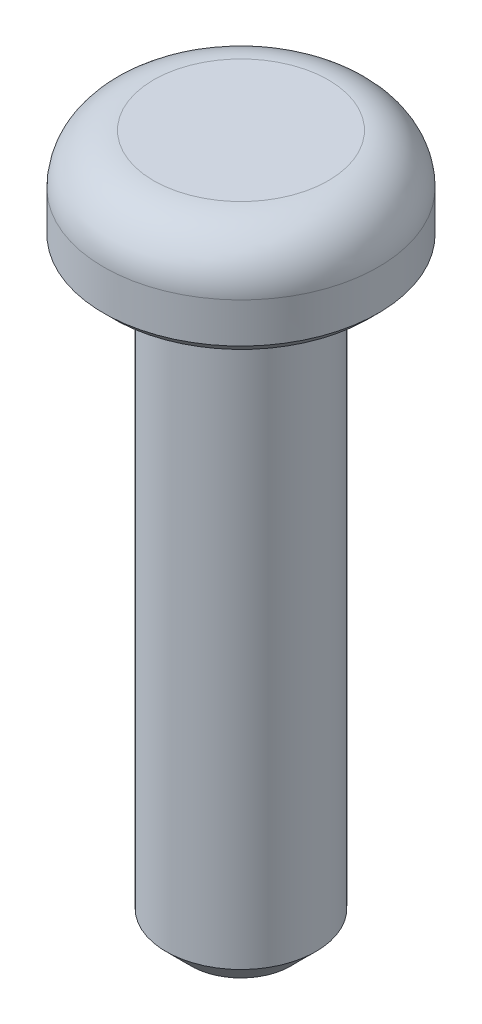
ISO-10303-21;
HEADER;
FILE_DESCRIPTION(('STEP AP214'),'2;1');
FILE_NAME('part.step','',(''),(''),'','','');
FILE_SCHEMA(('AUTOMOTIVE_DESIGN { 1 0 10303 214 1 1 1 1 }'));
ENDSEC;
DATA;
#1=APPLICATION_CONTEXT('core data for automotive mechanical design processes');
#2=APPLICATION_PROTOCOL_DEFINITION('international standard','automotive_design',2000,#1);
#3=PRODUCT_CONTEXT('',#1,'mechanical');
#4=PRODUCT('Part','Part','',(#3));
#5=PRODUCT_RELATED_PRODUCT_CATEGORY('part','',(#4));
#6=PRODUCT_DEFINITION_FORMATION('','',#4);
#7=PRODUCT_DEFINITION_CONTEXT('part definition',#1,'design');
#8=PRODUCT_DEFINITION('design','',#6,#7);
#9=PRODUCT_DEFINITION_SHAPE('','',#8);
#10=(LENGTH_UNIT() NAMED_UNIT(*) SI_UNIT(.MILLI.,.METRE.));
#11=(NAMED_UNIT(*) PLANE_ANGLE_UNIT() SI_UNIT($,.RADIAN.));
#12=(NAMED_UNIT(*) SI_UNIT($,.STERADIAN.) SOLID_ANGLE_UNIT());
#13=UNCERTAINTY_MEASURE_WITH_UNIT(LENGTH_MEASURE(1.E-05),#10,'distance_accuracy_value','');
#14=(GEOMETRIC_REPRESENTATION_CONTEXT(3) GLOBAL_UNCERTAINTY_ASSIGNED_CONTEXT((#13)) GLOBAL_UNIT_ASSIGNED_CONTEXT((#10,
#11,#12)) REPRESENTATION_CONTEXT('',''));
#15=CARTESIAN_POINT('',(0.,0.,0.));
#16=DIRECTION('',(0.,0.,1.));
#17=DIRECTION('',(1.,0.,0.));
#18=AXIS2_PLACEMENT_3D('',#15,#16,#17);
#19=CARTESIAN_POINT('',(1.5,0.,0.));
#20=DIRECTION('',(0.,-1.,0.));
#21=DIRECTION('',(0.,0.,-1.));
#22=AXIS2_PLACEMENT_3D('',#19,#20,#21);
#23=PLANE('',#22);
#24=CARTESIAN_POINT('',(0.,0.,0.));
#25=DIRECTION('',(0.,-1.,0.));
#26=DIRECTION('',(0.,0.,-1.));
#27=AXIS2_PLACEMENT_3D('',#24,#25,#26);
#28=CIRCLE('',#27,0.999999999999998);
#29=CARTESIAN_POINT('',(0.,0.,-0.999999999999998));
#30=VERTEX_POINT('',#29);
#31=EDGE_CURVE('E45',#30,#30,#28,.T.);
#32=ORIENTED_EDGE('',*,*,#31,.T.);
#33=EDGE_LOOP('',(#32));
#34=FACE_BOUND('',#33,.T.);
#35=ADVANCED_FACE('F30',(#34),#23,.T.);
#36=CARTESIAN_POINT('',(0.,14.,0.));
#37=DIRECTION('',(0.,1.,0.));
#38=DIRECTION('',(0.,0.,1.));
#39=AXIS2_PLACEMENT_3D('',#36,#37,#38);
#40=PLANE('',#39);
#41=CARTESIAN_POINT('',(0.,14.,0.));
#42=DIRECTION('',(0.,1.,0.));
#43=DIRECTION('',(0.,0.,1.));
#44=AXIS2_PLACEMENT_3D('',#41,#42,#43);
#45=CIRCLE('',#44,1.75);
#46=CARTESIAN_POINT('',(0.,14.,1.75));
#47=VERTEX_POINT('',#46);
#48=EDGE_CURVE('E50',#47,#47,#45,.T.);
#49=ORIENTED_EDGE('',*,*,#48,.T.);
#50=EDGE_LOOP('',(#49));
#51=FACE_BOUND('',#50,.T.);
#52=ADVANCED_FACE('F73',(#51),#40,.T.);
#53=CARTESIAN_POINT('',(0.,0.,0.));
#54=DIRECTION('',(0.,-1.,0.));
#55=DIRECTION('',(0.,0.,-1.));
#56=AXIS2_PLACEMENT_3D('',#53,#54,#55);
#57=CYLINDRICAL_SURFACE('',#56,2.75);
#58=CARTESIAN_POINT('',(0.,12.2,0.));
#59=DIRECTION('',(0.,-1.,0.));
#60=DIRECTION('',(0.,0.,-1.));
#61=AXIS2_PLACEMENT_3D('',#58,#59,#60);
#62=CIRCLE('',#61,2.75);
#63=CARTESIAN_POINT('',(0.,12.2,-2.75));
#64=VERTEX_POINT('',#63);
#65=EDGE_CURVE('E10',#64,#64,#62,.F.);
#66=ORIENTED_EDGE('',*,*,#65,.T.);
#67=EDGE_LOOP('',(#66));
#68=FACE_BOUND('',#67,.T.);
#69=CARTESIAN_POINT('',(0.,13.,0.));
#70=DIRECTION('',(0.,1.,0.));
#71=DIRECTION('',(0.,0.,1.));
#72=AXIS2_PLACEMENT_3D('',#69,#70,#71);
#73=CIRCLE('',#72,2.75);
#74=CARTESIAN_POINT('',(0.,13.,2.75));
#75=VERTEX_POINT('',#74);
#76=EDGE_CURVE('E53',#75,#75,#73,.F.);
#77=ORIENTED_EDGE('',*,*,#76,.T.);
#78=EDGE_LOOP('',(#77));
#79=FACE_BOUND('',#78,.T.);
#80=ADVANCED_FACE('F64',(#68,#79),#57,.T.);
#81=CARTESIAN_POINT('',(2.75,12.,0.));
#82=DIRECTION('',(0.,-1.,0.));
#83=DIRECTION('',(0.,0.,-1.));
#84=AXIS2_PLACEMENT_3D('',#81,#82,#83);
#85=PLANE('',#84);
#86=CARTESIAN_POINT('',(0.,12.,0.));
#87=DIRECTION('',(0.,-1.,0.));
#88=DIRECTION('',(0.,0.,-1.));
#89=AXIS2_PLACEMENT_3D('',#86,#87,#88);
#90=CIRCLE('',#89,2.55);
#91=CARTESIAN_POINT('',(0.,12.,-2.55));
#92=VERTEX_POINT('',#91);
#93=EDGE_CURVE('E37',#92,#92,#90,.T.);
#94=ORIENTED_EDGE('',*,*,#93,.T.);
#95=EDGE_LOOP('',(#94));
#96=FACE_BOUND('',#95,.T.);
#97=CARTESIAN_POINT('',(0.,12.,0.));
#98=DIRECTION('',(0.,-1.,0.));
#99=DIRECTION('',(0.,0.,-1.));
#100=AXIS2_PLACEMENT_3D('',#97,#98,#99);
#101=CIRCLE('',#100,1.5);
#102=CARTESIAN_POINT('',(0.,12.,-1.5));
#103=VERTEX_POINT('',#102);
#104=EDGE_CURVE('E56',#103,#103,#101,.T.);
#105=ORIENTED_EDGE('',*,*,#104,.F.);
#106=EDGE_LOOP('',(#105));
#107=FACE_BOUND('',#106,.T.);
#108=ADVANCED_FACE('F62',(#96,#107),#85,.T.);
#109=CARTESIAN_POINT('',(0.,0.,0.));
#110=DIRECTION('',(0.,-1.,0.));
#111=DIRECTION('',(0.,0.,-1.));
#112=AXIS2_PLACEMENT_3D('',#109,#110,#111);
#113=CYLINDRICAL_SURFACE('',#112,1.5);
#114=CARTESIAN_POINT('',(0.,0.500000000000003,0.));
#115=DIRECTION('',(0.,-1.,0.));
#116=DIRECTION('',(0.,0.,-1.));
#117=AXIS2_PLACEMENT_3D('',#114,#115,#116);
#118=CIRCLE('',#117,1.5);
#119=CARTESIAN_POINT('',(0.,0.500000000000003,-1.5));
#120=VERTEX_POINT('',#119);
#121=EDGE_CURVE('E41',#120,#120,#118,.F.);
#122=ORIENTED_EDGE('',*,*,#121,.T.);
#123=EDGE_LOOP('',(#122));
#124=FACE_BOUND('',#123,.T.);
#125=ORIENTED_EDGE('',*,*,#104,.T.);
#126=EDGE_LOOP('',(#125));
#127=FACE_BOUND('',#126,.T.);
#128=ADVANCED_FACE('F60',(#124,#127),#113,.T.);
#129=CARTESIAN_POINT('',(0.,13.,0.));
#130=DIRECTION('',(0.,1.,0.));
#131=DIRECTION('',(0.,0.,1.));
#132=AXIS2_PLACEMENT_3D('',#129,#130,#131);
#133=TOROIDAL_SURFACE('',#132,1.75,1.);
#134=ORIENTED_EDGE('',*,*,#48,.F.);
#135=EDGE_LOOP('',(#134));
#136=FACE_BOUND('',#135,.T.);
#137=ORIENTED_EDGE('',*,*,#76,.F.);
#138=EDGE_LOOP('',(#137));
#139=FACE_BOUND('',#138,.T.);
#140=ADVANCED_FACE('F70',(#136,#139),#133,.T.);
#141=CARTESIAN_POINT('',(0.,0.,0.));
#142=DIRECTION('',(0.,1.,0.));
#143=DIRECTION('',(0.,0.,1.));
#144=AXIS2_PLACEMENT_3D('',#141,#142,#143);
#145=CONICAL_SURFACE('',#144,0.999999999999998,0.785398163397447);
#146=ORIENTED_EDGE('',*,*,#121,.F.);
#147=EDGE_LOOP('',(#146));
#148=FACE_BOUND('',#147,.T.);
#149=ORIENTED_EDGE('',*,*,#31,.F.);
#150=EDGE_LOOP('',(#149));
#151=FACE_BOUND('',#150,.T.);
#152=ADVANCED_FACE('F85',(#148,#151),#145,.T.);
#153=CARTESIAN_POINT('',(0.,12.,0.));
#154=DIRECTION('',(0.,1.,0.));
#155=DIRECTION('',(0.,0.,1.));
#156=AXIS2_PLACEMENT_3D('',#153,#154,#155);
#157=CONICAL_SURFACE('',#156,2.55,0.78539816339745);
#158=ORIENTED_EDGE('',*,*,#65,.F.);
#159=EDGE_LOOP('',(#158));
#160=FACE_BOUND('',#159,.T.);
#161=ORIENTED_EDGE('',*,*,#93,.F.);
#162=EDGE_LOOP('',(#161));
#163=FACE_BOUND('',#162,.T.);
#164=ADVANCED_FACE('F32',(#160,#163),#157,.T.);
#165=CLOSED_SHELL('',(#35,#52,#80,#108,#128,#140,#152,#164));
#166=MANIFOLD_SOLID_BREP('B2',#165);
#167=ADVANCED_BREP_SHAPE_REPRESENTATION('',(#18,#166),#14);
#168=SHAPE_DEFINITION_REPRESENTATION(#9,#167);
ENDSEC;
END-ISO-10303-21;
